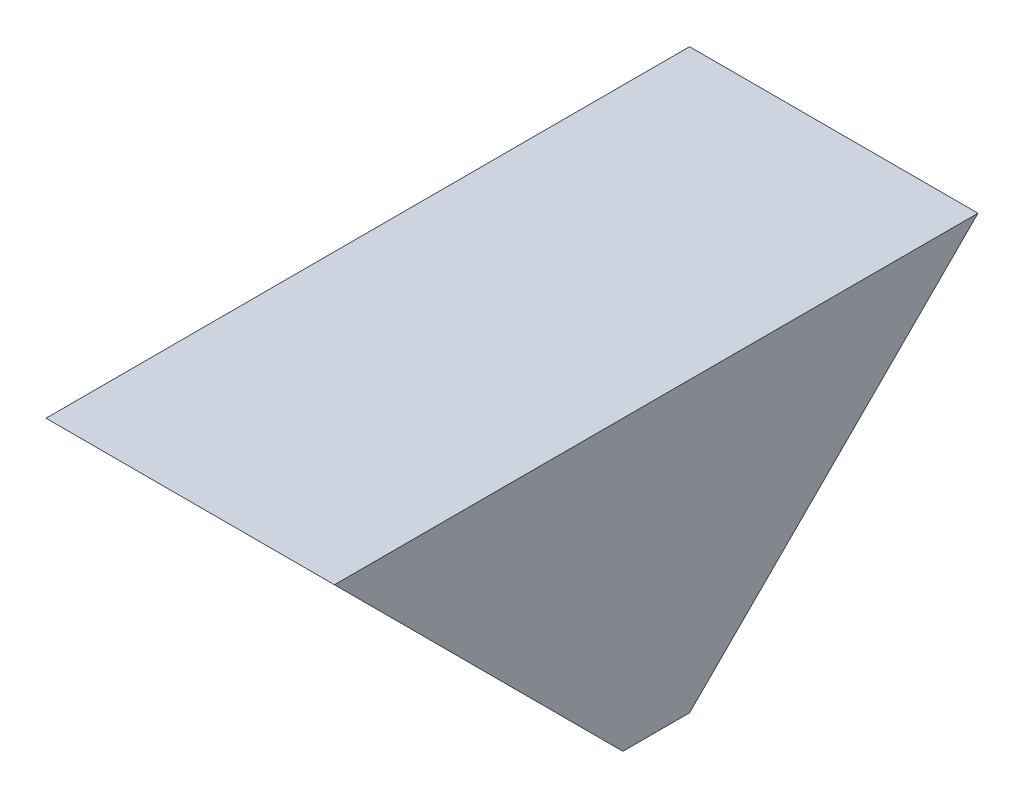
ISO-10303-21;
HEADER;
FILE_DESCRIPTION(('STEP AP214'),'2;1');
FILE_NAME('part.step','',(''),(''),'','','');
FILE_SCHEMA(('AUTOMOTIVE_DESIGN { 1 0 10303 214 1 1 1 1 }'));
ENDSEC;
DATA;
#1=APPLICATION_CONTEXT('core data for automotive mechanical design processes');
#2=APPLICATION_PROTOCOL_DEFINITION('international standard','automotive_design',2000,#1);
#3=PRODUCT_CONTEXT('',#1,'mechanical');
#4=PRODUCT('Part','Part','',(#3));
#5=PRODUCT_RELATED_PRODUCT_CATEGORY('part','',(#4));
#6=PRODUCT_DEFINITION_FORMATION('','',#4);
#7=PRODUCT_DEFINITION_CONTEXT('part definition',#1,'design');
#8=PRODUCT_DEFINITION('design','',#6,#7);
#9=PRODUCT_DEFINITION_SHAPE('','',#8);
#10=(LENGTH_UNIT() NAMED_UNIT(*) SI_UNIT(.MILLI.,.METRE.));
#11=(NAMED_UNIT(*) PLANE_ANGLE_UNIT() SI_UNIT($,.RADIAN.));
#12=(NAMED_UNIT(*) SI_UNIT($,.STERADIAN.) SOLID_ANGLE_UNIT());
#13=UNCERTAINTY_MEASURE_WITH_UNIT(LENGTH_MEASURE(1.E-05),#10,'distance_accuracy_value','');
#14=(GEOMETRIC_REPRESENTATION_CONTEXT(3) GLOBAL_UNCERTAINTY_ASSIGNED_CONTEXT((#13)) GLOBAL_UNIT_ASSIGNED_CONTEXT((#10,
#11,#12)) REPRESENTATION_CONTEXT('',''));
#15=CARTESIAN_POINT('',(0.,0.,0.));
#16=DIRECTION('',(0.,0.,1.));
#17=DIRECTION('',(1.,0.,0.));
#18=AXIS2_PLACEMENT_3D('',#15,#16,#17);
#19=CARTESIAN_POINT('',(0.,0.,-170.));
#20=DIRECTION('',(-1.,0.,0.));
#21=DIRECTION('',(0.,-1.,0.));
#22=AXIS2_PLACEMENT_3D('',#19,#20,#21);
#23=PLANE('',#22);
#24=DIRECTION('',(0.,-0.707106781186551,0.707106781186544));
#25=VECTOR('',#24,1.);
#26=CARTESIAN_POINT('',(0.,0.,-170.));
#27=LINE('',#26,#25);
#28=CARTESIAN_POINT('',(0.,0.,-170.));
#29=VERTEX_POINT('',#28);
#30=CARTESIAN_POINT('',(0.,-76.2,-93.8000000000008));
#31=VERTEX_POINT('',#30);
#32=EDGE_CURVE('E104',#29,#31,#27,.T.);
#33=ORIENTED_EDGE('',*,*,#32,.T.);
#34=DIRECTION('',(0.,0.,1.));
#35=VECTOR('',#34,1.);
#36=CARTESIAN_POINT('',(0.,-76.2,-170.));
#37=LINE('',#36,#35);
#38=CARTESIAN_POINT('',(0.,-76.2,-76.1999999999992));
#39=VERTEX_POINT('',#38);
#40=EDGE_CURVE('E115',#31,#39,#37,.T.);
#41=ORIENTED_EDGE('',*,*,#40,.T.);
#42=DIRECTION('',(0.,0.707106781186551,0.707106781186544));
#43=VECTOR('',#42,1.);
#44=CARTESIAN_POINT('',(0.,0.,0.));
#45=LINE('',#44,#43);
#46=CARTESIAN_POINT('',(0.,0.,0.));
#47=VERTEX_POINT('',#46);
#48=EDGE_CURVE('E157',#39,#47,#45,.T.);
#49=ORIENTED_EDGE('',*,*,#48,.T.);
#50=DIRECTION('',(0.,0.,1.));
#51=VECTOR('',#50,1.);
#52=CARTESIAN_POINT('',(0.,0.,-170.));
#53=LINE('',#52,#51);
#54=EDGE_CURVE('E118',#29,#47,#53,.T.);
#55=ORIENTED_EDGE('',*,*,#54,.F.);
#56=EDGE_LOOP('',(#33,#41,#49,#55));
#57=FACE_BOUND('',#56,.T.);
#58=ADVANCED_FACE('F37',(#57),#23,.T.);
#59=CARTESIAN_POINT('',(0.,0.,-170.));
#60=DIRECTION('',(0.,1.,0.));
#61=DIRECTION('',(0.,0.,1.));
#62=AXIS2_PLACEMENT_3D('',#59,#60,#61);
#63=PLANE('',#62);
#64=DIRECTION('',(-1.,0.,0.));
#65=VECTOR('',#64,1.);
#66=CARTESIAN_POINT('',(0.,0.,0.));
#67=LINE('',#66,#65);
#68=CARTESIAN_POINT('',(76.2,0.,0.));
#69=VERTEX_POINT('',#68);
#70=EDGE_CURVE('E130',#69,#47,#67,.T.);
#71=ORIENTED_EDGE('',*,*,#70,.F.);
#72=DIRECTION('',(0.,0.,1.));
#73=VECTOR('',#72,1.);
#74=CARTESIAN_POINT('',(76.2,0.,-170.));
#75=LINE('',#74,#73);
#76=CARTESIAN_POINT('',(76.2,0.,-170.));
#77=VERTEX_POINT('',#76);
#78=EDGE_CURVE('E128',#77,#69,#75,.T.);
#79=ORIENTED_EDGE('',*,*,#78,.F.);
#80=DIRECTION('',(-1.,0.,0.));
#81=VECTOR('',#80,1.);
#82=CARTESIAN_POINT('',(0.,0.,-170.));
#83=LINE('',#82,#81);
#84=EDGE_CURVE('E126',#77,#29,#83,.T.);
#85=ORIENTED_EDGE('',*,*,#84,.T.);
#86=ORIENTED_EDGE('',*,*,#54,.T.);
#87=EDGE_LOOP('',(#71,#79,#85,#86));
#88=FACE_BOUND('',#87,.T.);
#89=ADVANCED_FACE('F188',(#88),#63,.T.);
#90=CARTESIAN_POINT('',(76.2,0.,-170.));
#91=DIRECTION('',(1.,0.,0.));
#92=DIRECTION('',(0.,1.,0.));
#93=AXIS2_PLACEMENT_3D('',#90,#91,#92);
#94=PLANE('',#93);
#95=DIRECTION('',(0.,-0.707106781186551,0.707106781186544));
#96=VECTOR('',#95,1.);
#97=CARTESIAN_POINT('',(76.2,0.,-170.));
#98=LINE('',#97,#96);
#99=CARTESIAN_POINT('',(76.2,-76.2,-93.8000000000008));
#100=VERTEX_POINT('',#99);
#101=EDGE_CURVE('E107',#77,#100,#98,.T.);
#102=ORIENTED_EDGE('',*,*,#101,.F.);
#103=ORIENTED_EDGE('',*,*,#78,.T.);
#104=DIRECTION('',(0.,0.707106781186551,0.707106781186544));
#105=VECTOR('',#104,1.);
#106=CARTESIAN_POINT('',(76.2,0.,0.));
#107=LINE('',#106,#105);
#108=CARTESIAN_POINT('',(76.2,-76.2,-76.1999999999992));
#109=VERTEX_POINT('',#108);
#110=EDGE_CURVE('E159',#109,#69,#107,.T.);
#111=ORIENTED_EDGE('',*,*,#110,.F.);
#112=DIRECTION('',(0.,0.,1.));
#113=VECTOR('',#112,1.);
#114=CARTESIAN_POINT('',(76.2,-76.2,-170.));
#115=LINE('',#114,#113);
#116=EDGE_CURVE('E125',#100,#109,#115,.T.);
#117=ORIENTED_EDGE('',*,*,#116,.F.);
#118=EDGE_LOOP('',(#102,#103,#111,#117));
#119=FACE_BOUND('',#118,.T.);
#120=ADVANCED_FACE('F192',(#119),#94,.T.);
#121=CARTESIAN_POINT('',(0.,-76.2,-170.));
#122=DIRECTION('',(0.,-1.,0.));
#123=DIRECTION('',(0.,0.,-1.));
#124=AXIS2_PLACEMENT_3D('',#121,#122,#123);
#125=PLANE('',#124);
#126=DIRECTION('',(1.,0.,0.));
#127=VECTOR('',#126,1.);
#128=CARTESIAN_POINT('',(-107.763073452829,-76.2,-93.8000000000008));
#129=LINE('',#128,#127);
#130=EDGE_CURVE('E101',#31,#100,#129,.T.);
#131=ORIENTED_EDGE('',*,*,#130,.T.);
#132=ORIENTED_EDGE('',*,*,#116,.T.);
#133=DIRECTION('',(1.,0.,0.));
#134=VECTOR('',#133,1.);
#135=CARTESIAN_POINT('',(-107.763073452829,-76.2,-76.1999999999992));
#136=LINE('',#135,#134);
#137=EDGE_CURVE('E124',#39,#109,#136,.T.);
#138=ORIENTED_EDGE('',*,*,#137,.F.);
#139=ORIENTED_EDGE('',*,*,#40,.F.);
#140=EDGE_LOOP('',(#131,#132,#138,#139));
#141=FACE_BOUND('',#140,.T.);
#142=ADVANCED_FACE('F122',(#141),#125,.T.);
#143=CARTESIAN_POINT('',(4.7625,-4.7625,-170.));
#144=DIRECTION('',(-1.,0.,0.));
#145=DIRECTION('',(0.,0.,1.));
#146=AXIS2_PLACEMENT_3D('',#143,#144,#145);
#147=PLANE('',#146);
#148=DIRECTION('',(0.,0.,1.));
#149=VECTOR('',#148,1.);
#150=CARTESIAN_POINT('',(4.7625,-71.4375,-170.));
#151=LINE('',#150,#149);
#152=CARTESIAN_POINT('',(4.7625,-71.4375,-98.5625000000008));
#153=VERTEX_POINT('',#152);
#154=CARTESIAN_POINT('',(4.7625,-71.4375,-71.4374999999992));
#155=VERTEX_POINT('',#154);
#156=EDGE_CURVE('E143',#153,#155,#151,.T.);
#157=ORIENTED_EDGE('',*,*,#156,.F.);
#158=DIRECTION('',(0.,0.707106781186551,-0.707106781186544));
#159=VECTOR('',#158,1.);
#160=CARTESIAN_POINT('',(4.7625,-2.38125000000003,-167.61875));
#161=LINE('',#160,#159);
#162=CARTESIAN_POINT('',(4.7625,-4.7625,-165.2375));
#163=VERTEX_POINT('',#162);
#164=EDGE_CURVE('E51',#153,#163,#161,.T.);
#165=ORIENTED_EDGE('',*,*,#164,.T.);
#166=DIRECTION('',(0.,0.,1.));
#167=VECTOR('',#166,1.);
#168=CARTESIAN_POINT('',(4.7625,-4.7625,-170.));
#169=LINE('',#168,#167);
#170=CARTESIAN_POINT('',(4.7625,-4.7625,-4.76249999999995));
#171=VERTEX_POINT('',#170);
#172=EDGE_CURVE('E141',#163,#171,#169,.T.);
#173=ORIENTED_EDGE('',*,*,#172,.T.);
#174=DIRECTION('',(0.,-0.707106781186551,-0.707106781186544));
#175=VECTOR('',#174,1.);
#176=CARTESIAN_POINT('',(4.7625,-87.38125,-87.3812499999991));
#177=LINE('',#176,#175);
#178=EDGE_CURVE('E145',#171,#155,#177,.T.);
#179=ORIENTED_EDGE('',*,*,#178,.T.);
#180=EDGE_LOOP('',(#157,#165,#173,#179));
#181=FACE_BOUND('',#180,.T.);
#182=ADVANCED_FACE('F172',(#181),#147,.F.);
#183=CARTESIAN_POINT('',(4.7625,-4.7625,-170.));
#184=DIRECTION('',(0.,1.,0.));
#185=DIRECTION('',(0.,0.,1.));
#186=AXIS2_PLACEMENT_3D('',#183,#184,#185);
#187=PLANE('',#186);
#188=ORIENTED_EDGE('',*,*,#172,.F.);
#189=DIRECTION('',(1.,0.,0.));
#190=VECTOR('',#189,1.);
#191=CARTESIAN_POINT('',(4.7625,-4.7625,-165.2375));
#192=LINE('',#191,#190);
#193=CARTESIAN_POINT('',(71.4375,-4.7625,-165.2375));
#194=VERTEX_POINT('',#193);
#195=EDGE_CURVE('E163',#163,#194,#192,.T.);
#196=ORIENTED_EDGE('',*,*,#195,.T.);
#197=DIRECTION('',(0.,0.,1.));
#198=VECTOR('',#197,1.);
#199=CARTESIAN_POINT('',(71.4375,-4.7625,-170.));
#200=LINE('',#199,#198);
#201=CARTESIAN_POINT('',(71.4375,-4.7625,-4.76249999999996));
#202=VERTEX_POINT('',#201);
#203=EDGE_CURVE('E147',#194,#202,#200,.T.);
#204=ORIENTED_EDGE('',*,*,#203,.T.);
#205=DIRECTION('',(-1.,0.,0.));
#206=VECTOR('',#205,1.);
#207=CARTESIAN_POINT('',(4.76250000000003,-4.7625,-4.76249999999995));
#208=LINE('',#207,#206);
#209=EDGE_CURVE('E152',#202,#171,#208,.T.);
#210=ORIENTED_EDGE('',*,*,#209,.T.);
#211=EDGE_LOOP('',(#188,#196,#204,#210));
#212=FACE_BOUND('',#211,.T.);
#213=ADVANCED_FACE('F179',(#212),#187,.F.);
#214=CARTESIAN_POINT('',(71.4375,-4.7625,-170.));
#215=DIRECTION('',(1.,0.,0.));
#216=DIRECTION('',(0.,0.,-1.));
#217=AXIS2_PLACEMENT_3D('',#214,#215,#216);
#218=PLANE('',#217);
#219=ORIENTED_EDGE('',*,*,#203,.F.);
#220=DIRECTION('',(0.,-0.707106781186551,0.707106781186544));
#221=VECTOR('',#220,1.);
#222=CARTESIAN_POINT('',(71.4375,-2.38125000000003,-167.61875));
#223=LINE('',#222,#221);
#224=CARTESIAN_POINT('',(71.4375,-71.4375,-98.5625000000008));
#225=VERTEX_POINT('',#224);
#226=EDGE_CURVE('E111',#194,#225,#223,.T.);
#227=ORIENTED_EDGE('',*,*,#226,.T.);
#228=DIRECTION('',(0.,0.,1.));
#229=VECTOR('',#228,1.);
#230=CARTESIAN_POINT('',(71.4375,-71.4375,-170.));
#231=LINE('',#230,#229);
#232=CARTESIAN_POINT('',(71.4375,-71.4375,-71.4374999999993));
#233=VERTEX_POINT('',#232);
#234=EDGE_CURVE('E58',#225,#233,#231,.T.);
#235=ORIENTED_EDGE('',*,*,#234,.T.);
#236=DIRECTION('',(0.,0.707106781186551,0.707106781186544));
#237=VECTOR('',#236,1.);
#238=CARTESIAN_POINT('',(71.4375,-87.38125,-87.3812499999991));
#239=LINE('',#238,#237);
#240=EDGE_CURVE('E155',#233,#202,#239,.T.);
#241=ORIENTED_EDGE('',*,*,#240,.T.);
#242=EDGE_LOOP('',(#219,#227,#235,#241));
#243=FACE_BOUND('',#242,.T.);
#244=ADVANCED_FACE('F168',(#243),#218,.F.);
#245=CARTESIAN_POINT('',(4.7625,-71.4375,-170.));
#246=DIRECTION('',(0.,-1.,0.));
#247=DIRECTION('',(0.,0.,-1.));
#248=AXIS2_PLACEMENT_3D('',#245,#246,#247);
#249=PLANE('',#248);
#250=ORIENTED_EDGE('',*,*,#234,.F.);
#251=DIRECTION('',(-1.,0.,0.));
#252=VECTOR('',#251,1.);
#253=CARTESIAN_POINT('',(4.76249999999999,-71.4375,-98.5625000000008));
#254=LINE('',#253,#252);
#255=EDGE_CURVE('E11',#225,#153,#254,.T.);
#256=ORIENTED_EDGE('',*,*,#255,.T.);
#257=ORIENTED_EDGE('',*,*,#156,.T.);
#258=DIRECTION('',(1.,0.,0.));
#259=VECTOR('',#258,1.);
#260=CARTESIAN_POINT('',(4.76250000000002,-71.4375,-71.4374999999992));
#261=LINE('',#260,#259);
#262=EDGE_CURVE('E44',#155,#233,#261,.T.);
#263=ORIENTED_EDGE('',*,*,#262,.T.);
#264=EDGE_LOOP('',(#250,#256,#257,#263));
#265=FACE_BOUND('',#264,.T.);
#266=ADVANCED_FACE('F169',(#265),#249,.F.);
#267=CARTESIAN_POINT('',(-107.763073452829,0.,0.));
#268=DIRECTION('',(0.,0.707106781186544,-0.707106781186551));
#269=DIRECTION('',(0.,0.707106781186551,0.707106781186544));
#270=AXIS2_PLACEMENT_3D('',#267,#268,#269);
#271=PLANE('',#270);
#272=ORIENTED_EDGE('',*,*,#137,.T.);
#273=ORIENTED_EDGE('',*,*,#110,.T.);
#274=ORIENTED_EDGE('',*,*,#70,.T.);
#275=ORIENTED_EDGE('',*,*,#48,.F.);
#276=EDGE_LOOP('',(#272,#273,#274,#275));
#277=FACE_BOUND('',#276,.T.);
#278=ORIENTED_EDGE('',*,*,#209,.F.);
#279=ORIENTED_EDGE('',*,*,#240,.F.);
#280=ORIENTED_EDGE('',*,*,#262,.F.);
#281=ORIENTED_EDGE('',*,*,#178,.F.);
#282=EDGE_LOOP('',(#278,#279,#280,#281));
#283=FACE_BOUND('',#282,.T.);
#284=ADVANCED_FACE('F177',(#277,#283),#271,.F.);
#285=CARTESIAN_POINT('',(-107.763073452829,0.,-170.));
#286=DIRECTION('',(0.,0.707106781186544,0.707106781186551));
#287=DIRECTION('',(0.,-0.707106781186551,0.707106781186544));
#288=AXIS2_PLACEMENT_3D('',#285,#286,#287);
#289=PLANE('',#288);
#290=ORIENTED_EDGE('',*,*,#84,.F.);
#291=ORIENTED_EDGE('',*,*,#101,.T.);
#292=ORIENTED_EDGE('',*,*,#130,.F.);
#293=ORIENTED_EDGE('',*,*,#32,.F.);
#294=EDGE_LOOP('',(#290,#291,#292,#293));
#295=FACE_BOUND('',#294,.T.);
#296=ORIENTED_EDGE('',*,*,#255,.F.);
#297=ORIENTED_EDGE('',*,*,#226,.F.);
#298=ORIENTED_EDGE('',*,*,#195,.F.);
#299=ORIENTED_EDGE('',*,*,#164,.F.);
#300=EDGE_LOOP('',(#296,#297,#298,#299));
#301=FACE_BOUND('',#300,.T.);
#302=ADVANCED_FACE('F103',(#295,#301),#289,.F.);
#303=CLOSED_SHELL('',(#58,#89,#120,#142,#182,#213,#244,#266,#284,#302));
#304=MANIFOLD_SOLID_BREP('B2',#303);
#305=ADVANCED_BREP_SHAPE_REPRESENTATION('',(#18,#304),#14);
#306=SHAPE_DEFINITION_REPRESENTATION(#9,#305);
ENDSEC;
END-ISO-10303-21;
